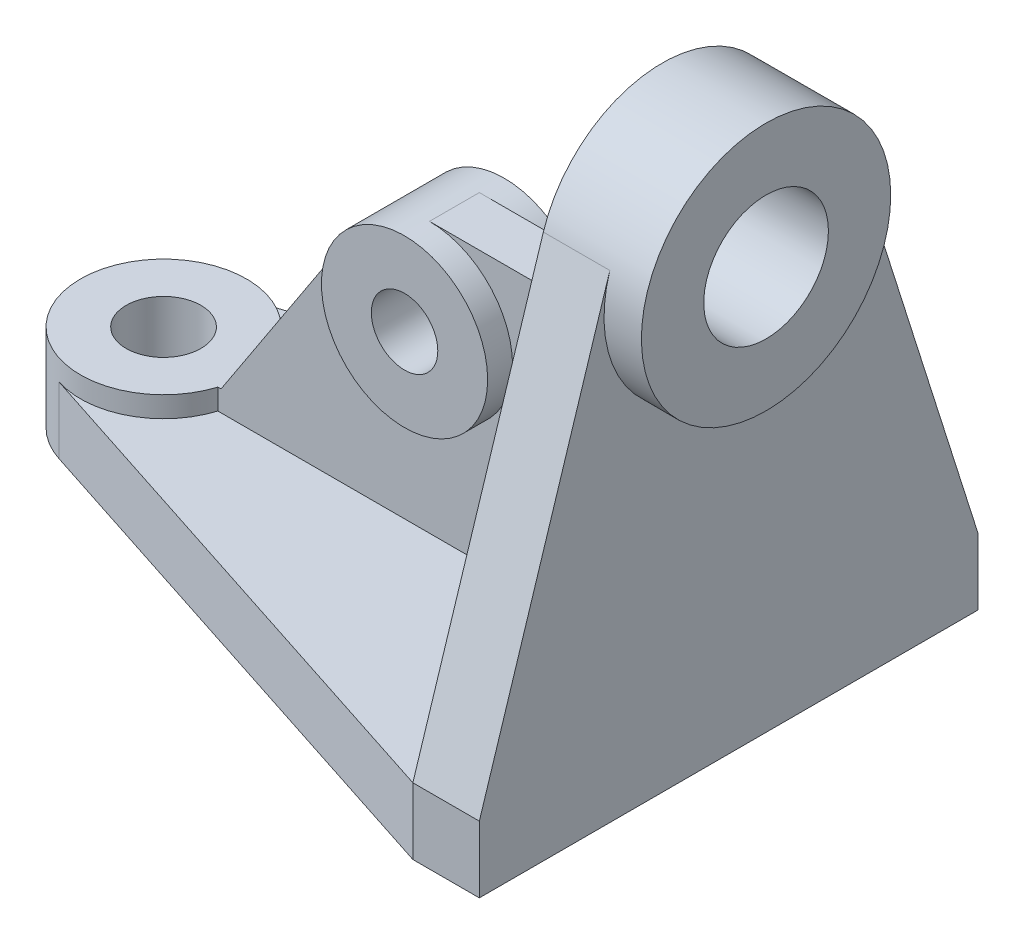
ISO-10303-21;
HEADER;
FILE_DESCRIPTION(('STEP AP214'),'2;1');
FILE_NAME('part.step','',(''),(''),'','','');
FILE_SCHEMA(('AUTOMOTIVE_DESIGN { 1 0 10303 214 1 1 1 1 }'));
ENDSEC;
DATA;
#1=APPLICATION_CONTEXT('core data for automotive mechanical design processes');
#2=APPLICATION_PROTOCOL_DEFINITION('international standard','automotive_design',2000,#1);
#3=PRODUCT_CONTEXT('',#1,'mechanical');
#4=PRODUCT('Part','Part','',(#3));
#5=PRODUCT_RELATED_PRODUCT_CATEGORY('part','',(#4));
#6=PRODUCT_DEFINITION_FORMATION('','',#4);
#7=PRODUCT_DEFINITION_CONTEXT('part definition',#1,'design');
#8=PRODUCT_DEFINITION('design','',#6,#7);
#9=PRODUCT_DEFINITION_SHAPE('','',#8);
#10=(LENGTH_UNIT() NAMED_UNIT(*) SI_UNIT(.MILLI.,.METRE.));
#11=(NAMED_UNIT(*) PLANE_ANGLE_UNIT() SI_UNIT($,.RADIAN.));
#12=(NAMED_UNIT(*) SI_UNIT($,.STERADIAN.) SOLID_ANGLE_UNIT());
#13=UNCERTAINTY_MEASURE_WITH_UNIT(LENGTH_MEASURE(1.E-05),#10,'distance_accuracy_value','');
#14=(GEOMETRIC_REPRESENTATION_CONTEXT(3) GLOBAL_UNCERTAINTY_ASSIGNED_CONTEXT((#13)) GLOBAL_UNIT_ASSIGNED_CONTEXT((#10,
#11,#12)) REPRESENTATION_CONTEXT('',''));
#15=CARTESIAN_POINT('',(0.,0.,0.));
#16=DIRECTION('',(0.,0.,1.));
#17=DIRECTION('',(1.,0.,0.));
#18=AXIS2_PLACEMENT_3D('',#15,#16,#17);
#19=CARTESIAN_POINT('',(0.,21.,0.));
#20=DIRECTION('',(0.,-1.,0.));
#21=DIRECTION('',(0.,0.,-1.));
#22=AXIS2_PLACEMENT_3D('',#19,#20,#21);
#23=CYLINDRICAL_SURFACE('',#22,20.);
#24=DIRECTION('',(0.,-1.,0.));
#25=VECTOR('',#24,1.);
#26=CARTESIAN_POINT('',(19.0787840283389,21.,6.));
#27=LINE('',#26,#25);
#28=CARTESIAN_POINT('',(19.0787840283389,21.,6.));
#29=VERTEX_POINT('',#28);
#30=CARTESIAN_POINT('',(19.0787840283389,16.,6.));
#31=VERTEX_POINT('',#30);
#32=EDGE_CURVE('E161',#29,#31,#27,.T.);
#33=ORIENTED_EDGE('',*,*,#32,.F.);
#34=CARTESIAN_POINT('',(0.,21.,0.));
#35=DIRECTION('',(0.,1.,0.));
#36=DIRECTION('',(0.,0.,1.));
#37=AXIS2_PLACEMENT_3D('',#34,#35,#36);
#38=CIRCLE('',#37,20.);
#39=CARTESIAN_POINT('',(19.0787840283389,21.,-6.));
#40=VERTEX_POINT('',#39);
#41=EDGE_CURVE('E60',#40,#29,#38,.T.);
#42=ORIENTED_EDGE('',*,*,#41,.F.);
#43=DIRECTION('',(0.,-1.,0.));
#44=VECTOR('',#43,1.);
#45=CARTESIAN_POINT('',(19.0787840283389,21.,-6.));
#46=LINE('',#45,#44);
#47=CARTESIAN_POINT('',(19.0787840283389,16.,-6.));
#48=VERTEX_POINT('',#47);
#49=EDGE_CURVE('E308',#48,#40,#46,.F.);
#50=ORIENTED_EDGE('',*,*,#49,.F.);
#51=CARTESIAN_POINT('',(0.,16.,0.));
#52=DIRECTION('',(0.,1.,0.));
#53=DIRECTION('',(0.,0.,1.));
#54=AXIS2_PLACEMENT_3D('',#51,#52,#53);
#55=CIRCLE('',#54,20.);
#56=CARTESIAN_POINT('',(-6.1776661076144,16.,-19.0219988818955));
#57=VERTEX_POINT('',#56);
#58=EDGE_CURVE('E238',#48,#57,#55,.T.);
#59=ORIENTED_EDGE('',*,*,#58,.T.);
#60=DIRECTION('',(0.,-1.,0.));
#61=VECTOR('',#60,1.);
#62=CARTESIAN_POINT('',(-6.1776661076144,16.,-19.0219988818955));
#63=LINE('',#62,#61);
#64=CARTESIAN_POINT('',(-6.1776661076144,0.,-19.0219988818955));
#65=VERTEX_POINT('',#64);
#66=EDGE_CURVE('E270',#57,#65,#63,.T.);
#67=ORIENTED_EDGE('',*,*,#66,.T.);
#68=CARTESIAN_POINT('',(0.,0.,0.));
#69=DIRECTION('',(0.,1.,0.));
#70=DIRECTION('',(0.,0.,1.));
#71=AXIS2_PLACEMENT_3D('',#68,#69,#70);
#72=CIRCLE('',#71,20.);
#73=CARTESIAN_POINT('',(-6.1776661076144,0.,19.0219988818955));
#74=VERTEX_POINT('',#73);
#75=EDGE_CURVE('E275',#65,#74,#72,.T.);
#76=ORIENTED_EDGE('',*,*,#75,.T.);
#77=DIRECTION('',(0.,-1.,0.));
#78=VECTOR('',#77,1.);
#79=CARTESIAN_POINT('',(-6.17766610761438,16.,19.0219988818955));
#80=LINE('',#79,#78);
#81=CARTESIAN_POINT('',(-6.17766610761439,16.,19.0219988818955));
#82=VERTEX_POINT('',#81);
#83=EDGE_CURVE('E267',#82,#74,#80,.T.);
#84=ORIENTED_EDGE('',*,*,#83,.F.);
#85=EDGE_CURVE('E239',#82,#31,#55,.T.);
#86=ORIENTED_EDGE('',*,*,#85,.T.);
#87=EDGE_LOOP('',(#33,#42,#50,#59,#67,#76,#84,#86));
#88=FACE_BOUND('',#87,.T.);
#89=ADVANCED_FACE('F39',(#88),#23,.T.);
#90=CARTESIAN_POINT('',(0.,16.,0.));
#91=DIRECTION('',(0.,1.,0.));
#92=DIRECTION('',(0.,0.,1.));
#93=AXIS2_PLACEMENT_3D('',#90,#91,#92);
#94=PLANE('',#93);
#95=DIRECTION('',(1.,0.,0.));
#96=VECTOR('',#95,1.);
#97=CARTESIAN_POINT('',(0.,16.,6.));
#98=LINE('',#97,#96);
#99=CARTESIAN_POINT('',(120.,16.,6.));
#100=VERTEX_POINT('',#99);
#101=EDGE_CURVE('E167',#31,#100,#98,.T.);
#102=ORIENTED_EDGE('',*,*,#101,.F.);
#103=ORIENTED_EDGE('',*,*,#85,.F.);
#104=DIRECTION('',(-0.951099944094773,0.,-0.30888330538072));
#105=VECTOR('',#104,1.);
#106=CARTESIAN_POINT('',(-6.1776661076144,16.,19.0219988818955));
#107=LINE('',#106,#105);
#108=CARTESIAN_POINT('',(120.,16.,60.));
#109=VERTEX_POINT('',#108);
#110=EDGE_CURVE('E242',#109,#82,#107,.T.);
#111=ORIENTED_EDGE('',*,*,#110,.F.);
#112=DIRECTION('',(0.,0.,1.));
#113=VECTOR('',#112,1.);
#114=CARTESIAN_POINT('',(120.,16.,0.));
#115=LINE('',#114,#113);
#116=EDGE_CURVE('E212',#100,#109,#115,.T.);
#117=ORIENTED_EDGE('',*,*,#116,.F.);
#118=EDGE_LOOP('',(#102,#103,#111,#117));
#119=FACE_BOUND('',#118,.T.);
#120=ADVANCED_FACE('F298',(#119),#94,.T.);
#121=ORIENTED_EDGE('',*,*,#58,.F.);
#122=DIRECTION('',(1.,0.,0.));
#123=VECTOR('',#122,1.);
#124=CARTESIAN_POINT('',(0.,16.,-6.));
#125=LINE('',#124,#123);
#126=CARTESIAN_POINT('',(120.,16.,-6.));
#127=VERTEX_POINT('',#126);
#128=EDGE_CURVE('E53',#48,#127,#125,.T.);
#129=ORIENTED_EDGE('',*,*,#128,.T.);
#130=CARTESIAN_POINT('',(120.,16.,-60.));
#131=VERTEX_POINT('',#130);
#132=EDGE_CURVE('E214',#131,#127,#115,.T.);
#133=ORIENTED_EDGE('',*,*,#132,.F.);
#134=DIRECTION('',(-0.951099944094773,0.,0.30888330538072));
#135=VECTOR('',#134,1.);
#136=CARTESIAN_POINT('',(-6.1776661076144,16.,-19.0219988818955));
#137=LINE('',#136,#135);
#138=EDGE_CURVE('E234',#131,#57,#137,.T.);
#139=ORIENTED_EDGE('',*,*,#138,.T.);
#140=EDGE_LOOP('',(#121,#129,#133,#139));
#141=FACE_BOUND('',#140,.T.);
#142=ADVANCED_FACE('F295',(#141),#94,.T.);
#143=CARTESIAN_POINT('',(0.,21.,0.));
#144=DIRECTION('',(0.,1.,0.));
#145=DIRECTION('',(0.,0.,1.));
#146=AXIS2_PLACEMENT_3D('',#143,#144,#145);
#147=PLANE('',#146);
#148=ORIENTED_EDGE('',*,*,#41,.T.);
#149=DIRECTION('',(1.,0.,0.));
#150=VECTOR('',#149,1.);
#151=CARTESIAN_POINT('',(19.8385853668185,21.,6.));
#152=LINE('',#151,#150);
#153=CARTESIAN_POINT('',(19.8385853668185,21.,6.));
#154=VERTEX_POINT('',#153);
#155=EDGE_CURVE('E156',#29,#154,#152,.T.);
#156=ORIENTED_EDGE('',*,*,#155,.T.);
#157=DIRECTION('',(0.,0.,-1.));
#158=VECTOR('',#157,1.);
#159=CARTESIAN_POINT('',(19.8385853668185,21.,0.));
#160=LINE('',#159,#158);
#161=CARTESIAN_POINT('',(19.8385853668185,21.,-6.));
#162=VERTEX_POINT('',#161);
#163=EDGE_CURVE('E11',#154,#162,#160,.T.);
#164=ORIENTED_EDGE('',*,*,#163,.T.);
#165=DIRECTION('',(-1.,0.,0.));
#166=VECTOR('',#165,1.);
#167=CARTESIAN_POINT('',(19.8385853668185,21.,-6.));
#168=LINE('',#167,#166);
#169=EDGE_CURVE('E306',#162,#40,#168,.T.);
#170=ORIENTED_EDGE('',*,*,#169,.T.);
#171=EDGE_LOOP('',(#148,#156,#164,#170));
#172=FACE_BOUND('',#171,.T.);
#173=CARTESIAN_POINT('',(0.,21.,0.));
#174=DIRECTION('',(0.,1.,0.));
#175=DIRECTION('',(0.,0.,1.));
#176=AXIS2_PLACEMENT_3D('',#173,#174,#175);
#177=CIRCLE('',#176,9.);
#178=CARTESIAN_POINT('',(0.,21.,-9.));
#179=VERTEX_POINT('',#178);
#180=EDGE_CURVE('E46',#179,#179,#177,.T.);
#181=ORIENTED_EDGE('',*,*,#180,.F.);
#182=EDGE_LOOP('',(#181));
#183=FACE_BOUND('',#182,.T.);
#184=ADVANCED_FACE('F157',(#172,#183),#147,.T.);
#185=CARTESIAN_POINT('',(0.,21.,0.));
#186=DIRECTION('',(0.,-1.,0.));
#187=DIRECTION('',(0.,0.,-1.));
#188=AXIS2_PLACEMENT_3D('',#185,#186,#187);
#189=CYLINDRICAL_SURFACE('',#188,9.);
#190=CARTESIAN_POINT('',(0.,0.,0.));
#191=DIRECTION('',(0.,1.,0.));
#192=DIRECTION('',(0.,0.,1.));
#193=AXIS2_PLACEMENT_3D('',#190,#191,#192);
#194=CIRCLE('',#193,9.);
#195=CARTESIAN_POINT('',(0.,0.,-9.));
#196=VERTEX_POINT('',#195);
#197=EDGE_CURVE('E277',#196,#196,#194,.T.);
#198=CARTESIAN_POINT('',(0.,21.,-9.));
#199=CARTESIAN_POINT('',(0.,20.78125,-9.));
#200=CARTESIAN_POINT('',(0.,20.5625,-9.));
#201=CARTESIAN_POINT('',(0.,20.125,-9.));
#202=CARTESIAN_POINT('',(0.,19.90625,-9.));
#203=CARTESIAN_POINT('',(0.,19.46875,-9.));
#204=CARTESIAN_POINT('',(0.,19.25,-9.));
#205=CARTESIAN_POINT('',(0.,18.8125,-9.));
#206=CARTESIAN_POINT('',(0.,18.59375,-9.));
#207=CARTESIAN_POINT('',(0.,18.15625,-9.));
#208=CARTESIAN_POINT('',(0.,17.9375,-9.));
#209=CARTESIAN_POINT('',(0.,17.5,-9.));
#210=CARTESIAN_POINT('',(0.,17.28125,-9.));
#211=CARTESIAN_POINT('',(0.,16.84375,-9.));
#212=CARTESIAN_POINT('',(0.,16.625,-9.));
#213=CARTESIAN_POINT('',(0.,16.1875,-9.));
#214=CARTESIAN_POINT('',(0.,15.96875,-9.));
#215=CARTESIAN_POINT('',(0.,15.53125,-9.));
#216=CARTESIAN_POINT('',(0.,15.3125,-9.));
#217=CARTESIAN_POINT('',(0.,14.875,-9.));
#218=CARTESIAN_POINT('',(0.,14.65625,-9.));
#219=CARTESIAN_POINT('',(0.,14.21875,-9.));
#220=CARTESIAN_POINT('',(0.,14.,-9.));
#221=CARTESIAN_POINT('',(0.,13.5625,-9.));
#222=CARTESIAN_POINT('',(0.,13.34375,-9.));
#223=CARTESIAN_POINT('',(0.,12.90625,-9.));
#224=CARTESIAN_POINT('',(0.,12.6875,-9.));
#225=CARTESIAN_POINT('',(0.,12.25,-9.));
#226=CARTESIAN_POINT('',(0.,12.03125,-9.));
#227=CARTESIAN_POINT('',(0.,11.59375,-9.));
#228=CARTESIAN_POINT('',(0.,11.375,-9.));
#229=CARTESIAN_POINT('',(0.,10.9375,-9.));
#230=CARTESIAN_POINT('',(0.,10.71875,-9.));
#231=CARTESIAN_POINT('',(0.,10.28125,-9.));
#232=CARTESIAN_POINT('',(0.,10.0625,-9.));
#233=CARTESIAN_POINT('',(0.,9.625,-9.));
#234=CARTESIAN_POINT('',(0.,9.40625,-9.));
#235=CARTESIAN_POINT('',(0.,8.96875,-9.));
#236=CARTESIAN_POINT('',(0.,8.75,-9.));
#237=CARTESIAN_POINT('',(0.,8.3125,-9.));
#238=CARTESIAN_POINT('',(0.,8.09375,-9.));
#239=CARTESIAN_POINT('',(0.,7.65625,-9.));
#240=CARTESIAN_POINT('',(0.,7.4375,-9.));
#241=CARTESIAN_POINT('',(0.,7.,-9.));
#242=CARTESIAN_POINT('',(0.,6.78125,-9.));
#243=CARTESIAN_POINT('',(0.,6.34375,-9.));
#244=CARTESIAN_POINT('',(0.,6.125,-9.));
#245=CARTESIAN_POINT('',(0.,5.6875,-9.));
#246=CARTESIAN_POINT('',(0.,5.46875,-9.));
#247=CARTESIAN_POINT('',(0.,5.03125,-9.));
#248=CARTESIAN_POINT('',(0.,4.8125,-9.));
#249=CARTESIAN_POINT('',(0.,4.375,-9.));
#250=CARTESIAN_POINT('',(0.,4.15625,-9.));
#251=CARTESIAN_POINT('',(0.,3.71875,-9.));
#252=CARTESIAN_POINT('',(0.,3.5,-9.));
#253=CARTESIAN_POINT('',(0.,3.0625,-9.));
#254=CARTESIAN_POINT('',(0.,2.84375,-9.));
#255=CARTESIAN_POINT('',(0.,2.40625,-9.));
#256=CARTESIAN_POINT('',(0.,2.1875,-9.));
#257=CARTESIAN_POINT('',(0.,1.75,-9.));
#258=CARTESIAN_POINT('',(0.,1.53125,-9.));
#259=CARTESIAN_POINT('',(0.,1.09375,-9.));
#260=CARTESIAN_POINT('',(0.,0.875000000000001,-9.));
#261=CARTESIAN_POINT('',(0.,0.4375,-9.));
#262=CARTESIAN_POINT('',(0.,0.21875,-9.));
#263=CARTESIAN_POINT('',(0.,0.,-9.));
#264=B_SPLINE_CURVE_WITH_KNOTS('',3,(#198,#199,#200,#201,#202,#203,#204,#205,#206,#207,#208,
#209,#210,#211,#212,#213,#214,#215,#216,#217,#218,#219,#220,#221,#222,#223,#224,#225,#226,#227,
#228,#229,#230,#231,#232,#233,#234,#235,#236,#237,#238,#239,#240,#241,#242,#243,#244,#245,#246,
#247,#248,#249,#250,#251,#252,#253,#254,#255,#256,#257,#258,#259,#260,#261,#262,#263),
.UNSPECIFIED.,.F.,.F.,(4,2,2,2,2,2,2,2,2,2,2,2,2,2,2,2,2,2,2,2,2,2,2,2,2,2,2,2,2,2,2,2,4),(0.,
0.656249999999997,1.3125,1.96875,2.625,3.28125,3.9375,4.59375,5.25,5.90625,6.5625,7.21875,7.875,
8.53125,9.1875,9.84375,10.5,11.15625,11.8125,12.46875,13.125,13.78125,14.4375,15.09375,15.75,
16.40625,17.0625,17.71875,18.375,19.03125,19.6875,20.34375,21.),.UNSPECIFIED.);
#265=EDGE_CURVE('BSEAM285',#179,#196,#264,.T.);
#266=ORIENTED_EDGE('',*,*,#180,.T.);
#267=ORIENTED_EDGE('',*,*,#197,.F.);
#268=ORIENTED_EDGE('',*,*,#265,.T.);
#269=ORIENTED_EDGE('',*,*,#265,.F.);
#270=EDGE_LOOP('',(#266,#268,#267,#269));
#271=FACE_BOUND('',#270,.T.);
#272=ADVANCED_FACE('F285',(#271),#189,.F.);
#273=CARTESIAN_POINT('',(0.,0.,0.));
#274=DIRECTION('',(0.,1.,0.));
#275=DIRECTION('',(0.,0.,1.));
#276=AXIS2_PLACEMENT_3D('',#273,#274,#275);
#277=PLANE('',#276);
#278=ORIENTED_EDGE('',*,*,#75,.F.);
#279=DIRECTION('',(-0.951099944094773,0.,0.30888330538072));
#280=VECTOR('',#279,1.);
#281=CARTESIAN_POINT('',(-6.1776661076144,0.,-19.0219988818955));
#282=LINE('',#281,#280);
#283=CARTESIAN_POINT('',(120.,0.,-60.));
#284=VERTEX_POINT('',#283);
#285=EDGE_CURVE('E251',#284,#65,#282,.T.);
#286=ORIENTED_EDGE('',*,*,#285,.F.);
#287=DIRECTION('',(1.,0.,0.));
#288=VECTOR('',#287,1.);
#289=CARTESIAN_POINT('',(0.,0.,-60.));
#290=LINE('',#289,#288);
#291=CARTESIAN_POINT('',(136.,0.,-60.));
#292=VERTEX_POINT('',#291);
#293=EDGE_CURVE('E229',#284,#292,#290,.T.);
#294=ORIENTED_EDGE('',*,*,#293,.T.);
#295=DIRECTION('',(0.,0.,1.));
#296=VECTOR('',#295,1.);
#297=CARTESIAN_POINT('',(136.,0.,0.));
#298=LINE('',#297,#296);
#299=CARTESIAN_POINT('',(136.,0.,60.));
#300=VERTEX_POINT('',#299);
#301=EDGE_CURVE('E235',#292,#300,#298,.T.);
#302=ORIENTED_EDGE('',*,*,#301,.T.);
#303=DIRECTION('',(-1.,0.,0.));
#304=VECTOR('',#303,1.);
#305=CARTESIAN_POINT('',(0.,0.,60.));
#306=LINE('',#305,#304);
#307=CARTESIAN_POINT('',(120.,0.,60.));
#308=VERTEX_POINT('',#307);
#309=EDGE_CURVE('E257',#300,#308,#306,.T.);
#310=ORIENTED_EDGE('',*,*,#309,.T.);
#311=DIRECTION('',(-0.951099944094773,0.,-0.30888330538072));
#312=VECTOR('',#311,1.);
#313=CARTESIAN_POINT('',(-6.1776661076144,0.,19.0219988818955));
#314=LINE('',#313,#312);
#315=EDGE_CURVE('E254',#308,#74,#314,.T.);
#316=ORIENTED_EDGE('',*,*,#315,.T.);
#317=EDGE_LOOP('',(#278,#286,#294,#302,#310,#316));
#318=FACE_BOUND('',#317,.T.);
#319=ORIENTED_EDGE('',*,*,#197,.T.);
#320=EDGE_LOOP('',(#319));
#321=FACE_BOUND('',#320,.T.);
#322=ADVANCED_FACE('F283',(#318,#321),#277,.F.);
#323=CARTESIAN_POINT('',(0.,16.,-60.));
#324=DIRECTION('',(0.,0.,-1.));
#325=DIRECTION('',(-1.,0.,0.));
#326=AXIS2_PLACEMENT_3D('',#323,#324,#325);
#327=PLANE('',#326);
#328=ORIENTED_EDGE('',*,*,#293,.F.);
#329=DIRECTION('',(0.,-1.,0.));
#330=VECTOR('',#329,1.);
#331=CARTESIAN_POINT('',(120.,16.,-60.));
#332=LINE('',#331,#330);
#333=EDGE_CURVE('E273',#131,#284,#332,.T.);
#334=ORIENTED_EDGE('',*,*,#333,.F.);
#335=DIRECTION('',(1.,0.,0.));
#336=VECTOR('',#335,1.);
#337=CARTESIAN_POINT('',(0.,16.,-60.));
#338=LINE('',#337,#336);
#339=CARTESIAN_POINT('',(136.,16.,-60.));
#340=VERTEX_POINT('',#339);
#341=EDGE_CURVE('E231',#131,#340,#338,.T.);
#342=ORIENTED_EDGE('',*,*,#341,.T.);
#343=DIRECTION('',(0.,-1.,0.));
#344=VECTOR('',#343,1.);
#345=CARTESIAN_POINT('',(136.,16.,-60.));
#346=LINE('',#345,#344);
#347=EDGE_CURVE('E248',#340,#292,#346,.T.);
#348=ORIENTED_EDGE('',*,*,#347,.T.);
#349=EDGE_LOOP('',(#328,#334,#342,#348));
#350=FACE_BOUND('',#349,.T.);
#351=ADVANCED_FACE('F291',(#350),#327,.T.);
#352=CARTESIAN_POINT('',(-6.1776661076144,16.,-19.0219988818955));
#353=DIRECTION('',(0.30888330538072,0.,0.951099944094773));
#354=DIRECTION('',(0.951099944094773,0.,-0.30888330538072));
#355=AXIS2_PLACEMENT_3D('',#352,#353,#354);
#356=PLANE('',#355);
#357=ORIENTED_EDGE('',*,*,#285,.T.);
#358=ORIENTED_EDGE('',*,*,#66,.F.);
#359=ORIENTED_EDGE('',*,*,#138,.F.);
#360=ORIENTED_EDGE('',*,*,#333,.T.);
#361=EDGE_LOOP('',(#357,#358,#359,#360));
#362=FACE_BOUND('',#361,.T.);
#363=ADVANCED_FACE('F388',(#362),#356,.F.);
#364=CARTESIAN_POINT('',(-6.1776661076144,16.,19.0219988818955));
#365=DIRECTION('',(-0.30888330538072,0.,0.951099944094773));
#366=DIRECTION('',(0.951099944094773,0.,0.30888330538072));
#367=AXIS2_PLACEMENT_3D('',#364,#365,#366);
#368=PLANE('',#367);
#369=ORIENTED_EDGE('',*,*,#315,.F.);
#370=DIRECTION('',(0.,-1.,0.));
#371=VECTOR('',#370,1.);
#372=CARTESIAN_POINT('',(120.,16.,60.));
#373=LINE('',#372,#371);
#374=EDGE_CURVE('E265',#109,#308,#373,.T.);
#375=ORIENTED_EDGE('',*,*,#374,.F.);
#376=ORIENTED_EDGE('',*,*,#110,.T.);
#377=ORIENTED_EDGE('',*,*,#83,.T.);
#378=EDGE_LOOP('',(#369,#375,#376,#377));
#379=FACE_BOUND('',#378,.T.);
#380=ADVANCED_FACE('F384',(#379),#368,.T.);
#381=CARTESIAN_POINT('',(0.,16.,60.));
#382=DIRECTION('',(0.,0.,1.));
#383=DIRECTION('',(1.,0.,0.));
#384=AXIS2_PLACEMENT_3D('',#381,#382,#383);
#385=PLANE('',#384);
#386=ORIENTED_EDGE('',*,*,#309,.F.);
#387=DIRECTION('',(0.,-1.,0.));
#388=VECTOR('',#387,1.);
#389=CARTESIAN_POINT('',(136.,16.,60.));
#390=LINE('',#389,#388);
#391=CARTESIAN_POINT('',(136.,16.,60.));
#392=VERTEX_POINT('',#391);
#393=EDGE_CURVE('E263',#392,#300,#390,.T.);
#394=ORIENTED_EDGE('',*,*,#393,.F.);
#395=DIRECTION('',(-1.,0.,0.));
#396=VECTOR('',#395,1.);
#397=CARTESIAN_POINT('',(0.,16.,60.));
#398=LINE('',#397,#396);
#399=EDGE_CURVE('E245',#392,#109,#398,.T.);
#400=ORIENTED_EDGE('',*,*,#399,.T.);
#401=ORIENTED_EDGE('',*,*,#374,.T.);
#402=EDGE_LOOP('',(#386,#394,#400,#401));
#403=FACE_BOUND('',#402,.T.);
#404=ADVANCED_FACE('F380',(#403),#385,.T.);
#405=CARTESIAN_POINT('',(136.,16.,0.));
#406=DIRECTION('',(1.,0.,0.));
#407=DIRECTION('',(0.,0.,-1.));
#408=AXIS2_PLACEMENT_3D('',#405,#406,#407);
#409=PLANE('',#408);
#410=ORIENTED_EDGE('',*,*,#301,.F.);
#411=ORIENTED_EDGE('',*,*,#347,.F.);
#412=DIRECTION('',(0.,0.953254218877944,0.302169479251962));
#413=VECTOR('',#412,1.);
#414=CARTESIAN_POINT('',(136.,18.7435621618475,-59.1303256431252));
#415=LINE('',#414,#413);
#416=CARTESIAN_POINT('',(136.,115.065084377559,-28.5976265663383));
#417=VERTEX_POINT('',#416);
#418=EDGE_CURVE('E213',#340,#417,#415,.T.);
#419=ORIENTED_EDGE('',*,*,#418,.T.);
#420=CARTESIAN_POINT('',(136.,106.,0.));
#421=DIRECTION('',(1.,0.,0.));
#422=DIRECTION('',(0.,0.,-1.));
#423=AXIS2_PLACEMENT_3D('',#420,#421,#422);
#424=CIRCLE('',#423,30.);
#425=CARTESIAN_POINT('',(136.,115.065084377559,28.5976265663383));
#426=VERTEX_POINT('',#425);
#427=EDGE_CURVE('E205',#426,#417,#424,.T.);
#428=ORIENTED_EDGE('',*,*,#427,.F.);
#429=DIRECTION('',(0.,0.953254218877943,-0.302169479251962));
#430=VECTOR('',#429,1.);
#431=CARTESIAN_POINT('',(136.,18.7435621618475,59.1303256431252));
#432=LINE('',#431,#430);
#433=EDGE_CURVE('E221',#392,#426,#432,.T.);
#434=ORIENTED_EDGE('',*,*,#433,.F.);
#435=ORIENTED_EDGE('',*,*,#393,.T.);
#436=EDGE_LOOP('',(#410,#411,#419,#428,#434,#435));
#437=FACE_BOUND('',#436,.T.);
#438=ADVANCED_FACE('F373',(#437),#409,.T.);
#439=CARTESIAN_POINT('',(120.,18.7435621618475,-59.1303256431252));
#440=DIRECTION('',(0.,0.302169479251962,-0.953254218877943));
#441=DIRECTION('',(0.,0.953254218877944,0.302169479251962));
#442=AXIS2_PLACEMENT_3D('',#439,#440,#441);
#443=PLANE('',#442);
#444=ORIENTED_EDGE('',*,*,#418,.F.);
#445=ORIENTED_EDGE('',*,*,#341,.F.);
#446=DIRECTION('',(0.,0.953254218877944,0.302169479251962));
#447=VECTOR('',#446,1.);
#448=CARTESIAN_POINT('',(120.,18.7435621618475,-59.1303256431252));
#449=LINE('',#448,#447);
#450=CARTESIAN_POINT('',(120.,115.065084377559,-28.5976265663383));
#451=VERTEX_POINT('',#450);
#452=EDGE_CURVE('E216',#131,#451,#449,.T.);
#453=ORIENTED_EDGE('',*,*,#452,.T.);
#454=DIRECTION('',(1.,0.,0.));
#455=VECTOR('',#454,1.);
#456=CARTESIAN_POINT('',(120.,115.065084377559,-28.5976265663383));
#457=LINE('',#456,#455);
#458=EDGE_CURVE('E226',#451,#417,#457,.T.);
#459=ORIENTED_EDGE('',*,*,#458,.T.);
#460=EDGE_LOOP('',(#444,#445,#453,#459));
#461=FACE_BOUND('',#460,.T.);
#462=ADVANCED_FACE('F370',(#461),#443,.T.);
#463=CARTESIAN_POINT('',(120.,18.7435621618475,59.1303256431252));
#464=DIRECTION('',(0.,-0.302169479251962,-0.953254218877943));
#465=DIRECTION('',(0.,0.953254218877943,-0.302169479251962));
#466=AXIS2_PLACEMENT_3D('',#463,#464,#465);
#467=PLANE('',#466);
#468=ORIENTED_EDGE('',*,*,#433,.T.);
#469=DIRECTION('',(1.,0.,0.));
#470=VECTOR('',#469,1.);
#471=CARTESIAN_POINT('',(120.,115.065084377559,28.5976265663383));
#472=LINE('',#471,#470);
#473=CARTESIAN_POINT('',(120.,115.065084377559,28.5976265663383));
#474=VERTEX_POINT('',#473);
#475=EDGE_CURVE('E219',#474,#426,#472,.T.);
#476=ORIENTED_EDGE('',*,*,#475,.F.);
#477=DIRECTION('',(0.,0.953254218877943,-0.302169479251962));
#478=VECTOR('',#477,1.);
#479=CARTESIAN_POINT('',(120.,18.7435621618475,59.1303256431252));
#480=LINE('',#479,#478);
#481=EDGE_CURVE('E209',#109,#474,#480,.T.);
#482=ORIENTED_EDGE('',*,*,#481,.F.);
#483=ORIENTED_EDGE('',*,*,#399,.F.);
#484=EDGE_LOOP('',(#468,#476,#482,#483));
#485=FACE_BOUND('',#484,.T.);
#486=ADVANCED_FACE('F368',(#485),#467,.F.);
#487=CARTESIAN_POINT('',(120.,0.,0.));
#488=DIRECTION('',(1.,0.,0.));
#489=DIRECTION('',(0.,0.,-1.));
#490=AXIS2_PLACEMENT_3D('',#487,#488,#489);
#491=PLANE('',#490);
#492=DIRECTION('',(0.,0.,-1.));
#493=VECTOR('',#492,1.);
#494=CARTESIAN_POINT('',(120.,81.,6.));
#495=LINE('',#494,#493);
#496=CARTESIAN_POINT('',(120.,81.,6.));
#497=VERTEX_POINT('',#496);
#498=CARTESIAN_POINT('',(120.,81.,-6.));
#499=VERTEX_POINT('',#498);
#500=EDGE_CURVE('E192',#497,#499,#495,.T.);
#501=ORIENTED_EDGE('',*,*,#500,.F.);
#502=DIRECTION('',(0.,-1.,0.));
#503=VECTOR('',#502,1.);
#504=CARTESIAN_POINT('',(120.,0.,6.));
#505=LINE('',#504,#503);
#506=EDGE_CURVE('E170',#497,#100,#505,.T.);
#507=ORIENTED_EDGE('',*,*,#506,.T.);
#508=ORIENTED_EDGE('',*,*,#116,.T.);
#509=ORIENTED_EDGE('',*,*,#481,.T.);
#510=CARTESIAN_POINT('',(120.,106.,0.));
#511=DIRECTION('',(1.,0.,0.));
#512=DIRECTION('',(0.,0.,-1.));
#513=AXIS2_PLACEMENT_3D('',#510,#511,#512);
#514=CIRCLE('',#513,30.);
#515=EDGE_CURVE('E202',#451,#474,#514,.T.);
#516=ORIENTED_EDGE('',*,*,#515,.F.);
#517=ORIENTED_EDGE('',*,*,#452,.F.);
#518=ORIENTED_EDGE('',*,*,#132,.T.);
#519=DIRECTION('',(0.,-1.,0.));
#520=VECTOR('',#519,1.);
#521=CARTESIAN_POINT('',(120.,0.,-6.));
#522=LINE('',#521,#520);
#523=EDGE_CURVE('E187',#499,#127,#522,.T.);
#524=ORIENTED_EDGE('',*,*,#523,.F.);
#525=EDGE_LOOP('',(#501,#507,#508,#509,#516,#517,#518,#524));
#526=FACE_BOUND('',#525,.T.);
#527=CARTESIAN_POINT('',(120.,106.,0.));
#528=DIRECTION('',(1.,0.,0.));
#529=DIRECTION('',(0.,0.,-1.));
#530=AXIS2_PLACEMENT_3D('',#527,#528,#529);
#531=CIRCLE('',#530,15.);
#532=CARTESIAN_POINT('',(120.,106.,-15.));
#533=VERTEX_POINT('',#532);
#534=EDGE_CURVE('E197',#533,#533,#531,.T.);
#535=ORIENTED_EDGE('',*,*,#534,.T.);
#536=EDGE_LOOP('',(#535));
#537=FACE_BOUND('',#536,.T.);
#538=ADVANCED_FACE('F364',(#526,#537),#491,.F.);
#539=CARTESIAN_POINT('',(145.,106.,0.));
#540=DIRECTION('',(-1.,0.,0.));
#541=DIRECTION('',(0.,0.,1.));
#542=AXIS2_PLACEMENT_3D('',#539,#540,#541);
#543=CYLINDRICAL_SURFACE('',#542,15.);
#544=CARTESIAN_POINT('',(145.,106.,0.));
#545=DIRECTION('',(1.,0.,0.));
#546=DIRECTION('',(0.,0.,-1.));
#547=AXIS2_PLACEMENT_3D('',#544,#545,#546);
#548=CIRCLE('',#547,15.);
#549=CARTESIAN_POINT('',(145.,106.,-15.));
#550=VERTEX_POINT('',#549);
#551=EDGE_CURVE('E198',#550,#550,#548,.T.);
#552=ORIENTED_EDGE('',*,*,#551,.T.);
#553=EDGE_LOOP('',(#552));
#554=FACE_BOUND('',#553,.T.);
#555=ORIENTED_EDGE('',*,*,#534,.F.);
#556=EDGE_LOOP('',(#555));
#557=FACE_BOUND('',#556,.T.);
#558=ADVANCED_FACE('F360',(#554,#557),#543,.F.);
#559=CARTESIAN_POINT('',(145.,106.,0.));
#560=DIRECTION('',(-1.,0.,0.));
#561=DIRECTION('',(0.,0.,1.));
#562=AXIS2_PLACEMENT_3D('',#559,#560,#561);
#563=CYLINDRICAL_SURFACE('',#562,30.);
#564=ORIENTED_EDGE('',*,*,#458,.F.);
#565=ORIENTED_EDGE('',*,*,#515,.T.);
#566=ORIENTED_EDGE('',*,*,#475,.T.);
#567=ORIENTED_EDGE('',*,*,#427,.T.);
#568=EDGE_LOOP('',(#564,#565,#566,#567));
#569=FACE_BOUND('',#568,.T.);
#570=CARTESIAN_POINT('',(145.,106.,0.));
#571=DIRECTION('',(1.,0.,0.));
#572=DIRECTION('',(0.,0.,-1.));
#573=AXIS2_PLACEMENT_3D('',#570,#571,#572);
#574=CIRCLE('',#573,30.);
#575=CARTESIAN_POINT('',(145.,106.,-30.));
#576=VERTEX_POINT('',#575);
#577=EDGE_CURVE('E201',#576,#576,#574,.T.);
#578=ORIENTED_EDGE('',*,*,#577,.F.);
#579=EDGE_LOOP('',(#578));
#580=FACE_BOUND('',#579,.T.);
#581=ADVANCED_FACE('F356',(#569,#580),#563,.T.);
#582=CARTESIAN_POINT('',(145.,0.,0.));
#583=DIRECTION('',(1.,0.,0.));
#584=DIRECTION('',(0.,0.,-1.));
#585=AXIS2_PLACEMENT_3D('',#582,#583,#584);
#586=PLANE('',#585);
#587=ORIENTED_EDGE('',*,*,#551,.F.);
#588=EDGE_LOOP('',(#587));
#589=FACE_BOUND('',#588,.T.);
#590=ORIENTED_EDGE('',*,*,#577,.T.);
#591=EDGE_LOOP('',(#590));
#592=FACE_BOUND('',#591,.T.);
#593=ADVANCED_FACE('F353',(#589,#592),#586,.T.);
#594=CARTESIAN_POINT('',(4.23781520961711,-2.78018000834058,6.));
#595=DIRECTION('',(-0.836128107645382,0.548534217351436,0.));
#596=DIRECTION('',(-0.548534217351436,-0.836128107645382,0.));
#597=AXIS2_PLACEMENT_3D('',#594,#595,#596);
#598=PLANE('',#597);
#599=DIRECTION('',(0.548534217351436,0.836128107645382,0.));
#600=VECTOR('',#599,1.);
#601=CARTESIAN_POINT('',(4.23781520961711,-2.78018000834058,-6.));
#602=LINE('',#601,#600);
#603=CARTESIAN_POINT('',(53.2774378470924,71.9706843470287,-6.));
#604=VERTEX_POINT('',#603);
#605=EDGE_CURVE('E152',#162,#604,#602,.T.);
#606=ORIENTED_EDGE('',*,*,#605,.F.);
#607=ORIENTED_EDGE('',*,*,#163,.F.);
#608=DIRECTION('',(0.548534217351436,0.836128107645382,0.));
#609=VECTOR('',#608,1.);
#610=CARTESIAN_POINT('',(4.23781520961711,-2.78018000834058,6.));
#611=LINE('',#610,#609);
#612=CARTESIAN_POINT('',(53.2774378470924,71.9706843470287,6.));
#613=VERTEX_POINT('',#612);
#614=EDGE_CURVE('E150',#154,#613,#611,.T.);
#615=ORIENTED_EDGE('',*,*,#614,.T.);
#616=DIRECTION('',(0.,0.,-1.));
#617=VECTOR('',#616,1.);
#618=CARTESIAN_POINT('',(53.2774378470924,71.9706843470287,6.));
#619=LINE('',#618,#617);
#620=EDGE_CURVE('E195',#613,#604,#619,.T.);
#621=ORIENTED_EDGE('',*,*,#620,.T.);
#622=EDGE_LOOP('',(#606,#607,#615,#621));
#623=FACE_BOUND('',#622,.T.);
#624=ADVANCED_FACE('F147',(#623),#598,.T.);
#625=CARTESIAN_POINT('',(0.,81.,6.));
#626=DIRECTION('',(0.,1.,0.));
#627=DIRECTION('',(0.,0.,1.));
#628=AXIS2_PLACEMENT_3D('',#625,#626,#627);
#629=PLANE('',#628);
#630=DIRECTION('',(1.,0.,0.));
#631=VECTOR('',#630,1.);
#632=CARTESIAN_POINT('',(0.,81.,-6.));
#633=LINE('',#632,#631);
#634=CARTESIAN_POINT('',(70.,81.,-6.));
#635=VERTEX_POINT('',#634);
#636=EDGE_CURVE('E172',#635,#499,#633,.T.);
#637=ORIENTED_EDGE('',*,*,#636,.F.);
#638=DIRECTION('',(0.,0.,-1.));
#639=VECTOR('',#638,1.);
#640=CARTESIAN_POINT('',(70.,81.,6.));
#641=LINE('',#640,#639);
#642=CARTESIAN_POINT('',(70.,81.,6.));
#643=VERTEX_POINT('',#642);
#644=EDGE_CURVE('E180',#643,#635,#641,.T.);
#645=ORIENTED_EDGE('',*,*,#644,.F.);
#646=DIRECTION('',(1.,0.,0.));
#647=VECTOR('',#646,1.);
#648=CARTESIAN_POINT('',(0.,81.,6.));
#649=LINE('',#648,#647);
#650=EDGE_CURVE('E177',#643,#497,#649,.T.);
#651=ORIENTED_EDGE('',*,*,#650,.T.);
#652=ORIENTED_EDGE('',*,*,#500,.T.);
#653=EDGE_LOOP('',(#637,#645,#651,#652));
#654=FACE_BOUND('',#653,.T.);
#655=ADVANCED_FACE('F345',(#654),#629,.T.);
#656=CARTESIAN_POINT('',(0.,0.,6.));
#657=DIRECTION('',(0.,0.,1.));
#658=DIRECTION('',(1.,0.,0.));
#659=AXIS2_PLACEMENT_3D('',#656,#657,#658);
#660=PLANE('',#659);
#661=CARTESIAN_POINT('',(70.,61.,6.));
#662=DIRECTION('',(0.,0.,1.));
#663=DIRECTION('',(1.,0.,0.));
#664=AXIS2_PLACEMENT_3D('',#661,#662,#663);
#665=CIRCLE('',#664,20.);
#666=EDGE_CURVE('E166',#613,#643,#665,.T.);
#667=ORIENTED_EDGE('',*,*,#666,.F.);
#668=ORIENTED_EDGE('',*,*,#614,.F.);
#669=ORIENTED_EDGE('',*,*,#155,.F.);
#670=ORIENTED_EDGE('',*,*,#32,.T.);
#671=ORIENTED_EDGE('',*,*,#101,.T.);
#672=ORIENTED_EDGE('',*,*,#506,.F.);
#673=ORIENTED_EDGE('',*,*,#650,.F.);
#674=EDGE_LOOP('',(#667,#668,#669,#670,#671,#672,#673));
#675=FACE_BOUND('',#674,.T.);
#676=ADVANCED_FACE('F164',(#675),#660,.T.);
#677=CARTESIAN_POINT('',(0.,0.,-6.));
#678=DIRECTION('',(0.,0.,1.));
#679=DIRECTION('',(1.,0.,0.));
#680=AXIS2_PLACEMENT_3D('',#677,#678,#679);
#681=PLANE('',#680);
#682=CARTESIAN_POINT('',(70.,61.,-6.));
#683=DIRECTION('',(0.,0.,1.));
#684=DIRECTION('',(1.,0.,0.));
#685=AXIS2_PLACEMENT_3D('',#682,#683,#684);
#686=CIRCLE('',#685,20.);
#687=EDGE_CURVE('E181',#604,#635,#686,.T.);
#688=ORIENTED_EDGE('',*,*,#687,.T.);
#689=ORIENTED_EDGE('',*,*,#636,.T.);
#690=ORIENTED_EDGE('',*,*,#523,.T.);
#691=ORIENTED_EDGE('',*,*,#128,.F.);
#692=ORIENTED_EDGE('',*,*,#49,.T.);
#693=ORIENTED_EDGE('',*,*,#169,.F.);
#694=ORIENTED_EDGE('',*,*,#605,.T.);
#695=EDGE_LOOP('',(#688,#689,#690,#691,#692,#693,#694));
#696=FACE_BOUND('',#695,.T.);
#697=ADVANCED_FACE('F341',(#696),#681,.F.);
#698=CARTESIAN_POINT('',(70.,61.,12.));
#699=DIRECTION('',(0.,0.,-1.));
#700=DIRECTION('',(-1.,0.,0.));
#701=AXIS2_PLACEMENT_3D('',#698,#699,#700);
#702=CYLINDRICAL_SURFACE('',#701,7.99999999999999);
#703=CARTESIAN_POINT('',(70.,61.,12.));
#704=DIRECTION('',(0.,0.,1.));
#705=DIRECTION('',(1.,0.,0.));
#706=AXIS2_PLACEMENT_3D('',#703,#704,#705);
#707=CIRCLE('',#706,7.99999999999999);
#708=CARTESIAN_POINT('',(78.,61.,12.));
#709=VERTEX_POINT('',#708);
#710=EDGE_CURVE('E313',#709,#709,#707,.T.);
#711=ORIENTED_EDGE('',*,*,#710,.T.);
#712=EDGE_LOOP('',(#711));
#713=FACE_BOUND('',#712,.T.);
#714=CARTESIAN_POINT('',(70.,61.,-12.));
#715=DIRECTION('',(0.,0.,1.));
#716=DIRECTION('',(1.,0.,0.));
#717=AXIS2_PLACEMENT_3D('',#714,#715,#716);
#718=CIRCLE('',#717,7.99999999999999);
#719=CARTESIAN_POINT('',(78.,61.,-12.));
#720=VERTEX_POINT('',#719);
#721=EDGE_CURVE('E312',#720,#720,#718,.T.);
#722=ORIENTED_EDGE('',*,*,#721,.F.);
#723=EDGE_LOOP('',(#722));
#724=FACE_BOUND('',#723,.T.);
#725=ADVANCED_FACE('F337',(#713,#724),#702,.F.);
#726=CARTESIAN_POINT('',(70.,61.,12.));
#727=DIRECTION('',(0.,0.,-1.));
#728=DIRECTION('',(-1.,0.,0.));
#729=AXIS2_PLACEMENT_3D('',#726,#727,#728);
#730=CYLINDRICAL_SURFACE('',#729,20.);
#731=ORIENTED_EDGE('',*,*,#666,.T.);
#732=ORIENTED_EDGE('',*,*,#644,.T.);
#733=ORIENTED_EDGE('',*,*,#687,.F.);
#734=ORIENTED_EDGE('',*,*,#620,.F.);
#735=EDGE_LOOP('',(#731,#732,#733,#734));
#736=FACE_BOUND('',#735,.T.);
#737=CARTESIAN_POINT('',(70.,61.,12.));
#738=DIRECTION('',(0.,0.,1.));
#739=DIRECTION('',(1.,0.,0.));
#740=AXIS2_PLACEMENT_3D('',#737,#738,#739);
#741=CIRCLE('',#740,20.);
#742=CARTESIAN_POINT('',(90.,61.,12.));
#743=VERTEX_POINT('',#742);
#744=EDGE_CURVE('E184',#743,#743,#741,.T.);
#745=ORIENTED_EDGE('',*,*,#744,.F.);
#746=EDGE_LOOP('',(#745));
#747=FACE_BOUND('',#746,.T.);
#748=CARTESIAN_POINT('',(70.,61.,-12.));
#749=DIRECTION('',(0.,0.,1.));
#750=DIRECTION('',(1.,0.,0.));
#751=AXIS2_PLACEMENT_3D('',#748,#749,#750);
#752=CIRCLE('',#751,20.);
#753=CARTESIAN_POINT('',(90.,61.,-12.));
#754=VERTEX_POINT('',#753);
#755=EDGE_CURVE('E316',#754,#754,#752,.T.);
#756=ORIENTED_EDGE('',*,*,#755,.T.);
#757=EDGE_LOOP('',(#756));
#758=FACE_BOUND('',#757,.T.);
#759=ADVANCED_FACE('F323',(#736,#747,#758),#730,.T.);
#760=CARTESIAN_POINT('',(0.,0.,12.));
#761=DIRECTION('',(0.,0.,1.));
#762=DIRECTION('',(1.,0.,0.));
#763=AXIS2_PLACEMENT_3D('',#760,#761,#762);
#764=PLANE('',#763);
#765=ORIENTED_EDGE('',*,*,#710,.F.);
#766=EDGE_LOOP('',(#765));
#767=FACE_BOUND('',#766,.T.);
#768=ORIENTED_EDGE('',*,*,#744,.T.);
#769=EDGE_LOOP('',(#768));
#770=FACE_BOUND('',#769,.T.);
#771=ADVANCED_FACE('F326',(#767,#770),#764,.T.);
#772=CARTESIAN_POINT('',(0.,0.,-12.));
#773=DIRECTION('',(0.,0.,1.));
#774=DIRECTION('',(1.,0.,0.));
#775=AXIS2_PLACEMENT_3D('',#772,#773,#774);
#776=PLANE('',#775);
#777=ORIENTED_EDGE('',*,*,#721,.T.);
#778=EDGE_LOOP('',(#777));
#779=FACE_BOUND('',#778,.T.);
#780=ORIENTED_EDGE('',*,*,#755,.F.);
#781=EDGE_LOOP('',(#780));
#782=FACE_BOUND('',#781,.T.);
#783=ADVANCED_FACE('F325',(#779,#782),#776,.F.);
#784=CLOSED_SHELL('',(#89,#120,#142,#184,#272,#322,#351,#363,#380,#404,#438,#462,#486,#538,#558,
#581,#593,#624,#655,#676,#697,#725,#759,#771,#783));
#785=MANIFOLD_SOLID_BREP('B2',#784);
#786=ADVANCED_BREP_SHAPE_REPRESENTATION('',(#18,#785),#14);
#787=SHAPE_DEFINITION_REPRESENTATION(#9,#786);
ENDSEC;
END-ISO-10303-21;
